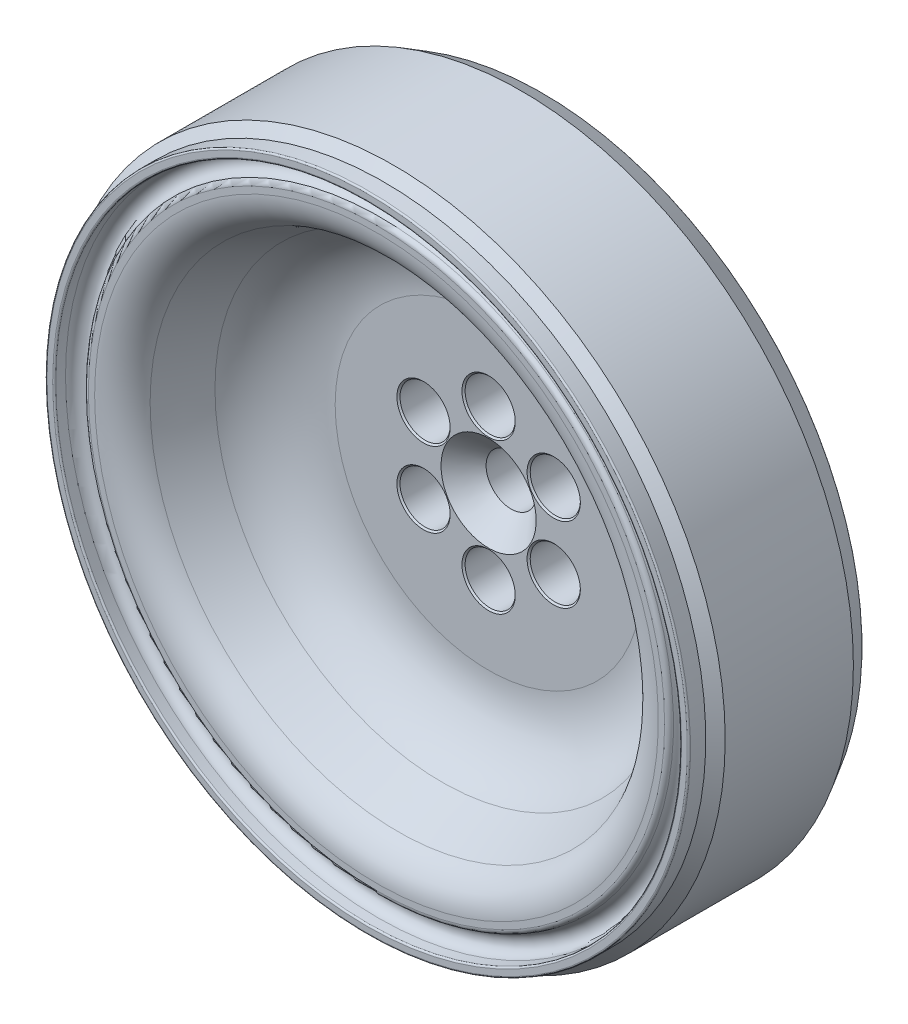
ISO-10303-21;
HEADER;
FILE_DESCRIPTION(('STEP AP214'),'2;1');
FILE_NAME('part.step','',(''),(''),'','','');
FILE_SCHEMA(('AUTOMOTIVE_DESIGN { 1 0 10303 214 1 1 1 1 }'));
ENDSEC;
DATA;
#1=APPLICATION_CONTEXT('core data for automotive mechanical design processes');
#2=APPLICATION_PROTOCOL_DEFINITION('international standard','automotive_design',2000,#1);
#3=PRODUCT_CONTEXT('',#1,'mechanical');
#4=PRODUCT('Part','Part','',(#3));
#5=PRODUCT_RELATED_PRODUCT_CATEGORY('part','',(#4));
#6=PRODUCT_DEFINITION_FORMATION('','',#4);
#7=PRODUCT_DEFINITION_CONTEXT('part definition',#1,'design');
#8=PRODUCT_DEFINITION('design','',#6,#7);
#9=PRODUCT_DEFINITION_SHAPE('','',#8);
#10=(LENGTH_UNIT() NAMED_UNIT(*) SI_UNIT(.MILLI.,.METRE.));
#11=(NAMED_UNIT(*) PLANE_ANGLE_UNIT() SI_UNIT($,.RADIAN.));
#12=(NAMED_UNIT(*) SI_UNIT($,.STERADIAN.) SOLID_ANGLE_UNIT());
#13=UNCERTAINTY_MEASURE_WITH_UNIT(LENGTH_MEASURE(1.E-05),#10,'distance_accuracy_value','');
#14=(GEOMETRIC_REPRESENTATION_CONTEXT(3) GLOBAL_UNCERTAINTY_ASSIGNED_CONTEXT((#13)) GLOBAL_UNIT_ASSIGNED_CONTEXT((#10,
#11,#12)) REPRESENTATION_CONTEXT('',''));
#15=CARTESIAN_POINT('',(0.,0.,0.));
#16=DIRECTION('',(0.,0.,1.));
#17=DIRECTION('',(1.,0.,0.));
#18=AXIS2_PLACEMENT_3D('',#15,#16,#17);
#19=CARTESIAN_POINT('',(0.,0.,34.25));
#20=DIRECTION('',(0.,0.,-1.));
#21=DIRECTION('',(-1.,0.,0.));
#22=AXIS2_PLACEMENT_3D('',#19,#20,#21);
#23=TOROIDAL_SURFACE('',#22,46.0026610811389,0.799999999999995);
#24=CARTESIAN_POINT('',(0.,0.,35.05));
#25=DIRECTION('',(0.,0.,-1.));
#26=DIRECTION('',(-1.,0.,0.));
#27=AXIS2_PLACEMENT_3D('',#24,#25,#26);
#28=CIRCLE('',#27,46.0026610811389);
#29=CARTESIAN_POINT('',(-46.0026610811389,0.,35.05));
#30=VERTEX_POINT('',#29);
#31=EDGE_CURVE('E159',#30,#30,#28,.T.);
#32=ORIENTED_EDGE('',*,*,#31,.T.);
#33=EDGE_LOOP('',(#32));
#34=FACE_BOUND('',#33,.T.);
#35=CARTESIAN_POINT('',(0.,0.,34.4166666666667));
#36=DIRECTION('',(0.,0.,-1.));
#37=DIRECTION('',(-1.,0.,0.));
#38=AXIS2_PLACEMENT_3D('',#35,#36,#37);
#39=CIRCLE('',#38,46.7851073874259);
#40=CARTESIAN_POINT('',(-46.7851073874259,0.,34.4166666666667));
#41=VERTEX_POINT('',#40);
#42=EDGE_CURVE('E234',#41,#41,#39,.T.);
#43=ORIENTED_EDGE('',*,*,#42,.F.);
#44=EDGE_LOOP('',(#43));
#45=FACE_BOUND('',#44,.T.);
#46=ADVANCED_FACE('F47',(#34,#45),#23,.T.);
#47=CARTESIAN_POINT('',(0.,0.,34.75));
#48=DIRECTION('',(0.,0.,-1.));
#49=DIRECTION('',(-1.,0.,0.));
#50=AXIS2_PLACEMENT_3D('',#47,#48,#49);
#51=TOROIDAL_SURFACE('',#50,48.35,1.60000000000001);
#52=ORIENTED_EDGE('',*,*,#42,.T.);
#53=EDGE_LOOP('',(#52));
#54=FACE_BOUND('',#53,.T.);
#55=CARTESIAN_POINT('',(0.,0.,34.75));
#56=DIRECTION('',(0.,0.,-1.));
#57=DIRECTION('',(-1.,0.,0.));
#58=AXIS2_PLACEMENT_3D('',#55,#56,#57);
#59=CIRCLE('',#58,49.95);
#60=CARTESIAN_POINT('',(-49.95,0.,34.75));
#61=VERTEX_POINT('',#60);
#62=EDGE_CURVE('E231',#61,#61,#59,.T.);
#63=ORIENTED_EDGE('',*,*,#62,.F.);
#64=EDGE_LOOP('',(#63));
#65=FACE_BOUND('',#64,.T.);
#66=ADVANCED_FACE('F249',(#54,#65),#51,.F.);
#67=CARTESIAN_POINT('',(0.,0.,0.));
#68=DIRECTION('',(0.,0.,-1.));
#69=DIRECTION('',(-1.,0.,0.));
#70=AXIS2_PLACEMENT_3D('',#67,#68,#69);
#71=CYLINDRICAL_SURFACE('',#70,49.95);
#72=ORIENTED_EDGE('',*,*,#62,.T.);
#73=EDGE_LOOP('',(#72));
#74=FACE_BOUND('',#73,.T.);
#75=CARTESIAN_POINT('',(0.,0.,36.3));
#76=DIRECTION('',(0.,0.,-1.));
#77=DIRECTION('',(-1.,0.,0.));
#78=AXIS2_PLACEMENT_3D('',#75,#76,#77);
#79=CIRCLE('',#78,49.95);
#80=CARTESIAN_POINT('',(-49.95,0.,36.3));
#81=VERTEX_POINT('',#80);
#82=EDGE_CURVE('E228',#81,#81,#79,.T.);
#83=ORIENTED_EDGE('',*,*,#82,.F.);
#84=EDGE_LOOP('',(#83));
#85=FACE_BOUND('',#84,.T.);
#86=ADVANCED_FACE('F254',(#74,#85),#71,.F.);
#87=CARTESIAN_POINT('',(0.,0.,36.3));
#88=DIRECTION('',(0.,0.,-1.));
#89=DIRECTION('',(-1.,0.,0.));
#90=AXIS2_PLACEMENT_3D('',#87,#88,#89);
#91=TOROIDAL_SURFACE('',#90,50.2,0.25);
#92=ORIENTED_EDGE('',*,*,#82,.T.);
#93=EDGE_LOOP('',(#92));
#94=FACE_BOUND('',#93,.T.);
#95=CARTESIAN_POINT('',(0.,0.,36.55));
#96=DIRECTION('',(0.,0.,-1.));
#97=DIRECTION('',(-1.,0.,0.));
#98=AXIS2_PLACEMENT_3D('',#95,#96,#97);
#99=CIRCLE('',#98,50.2);
#100=CARTESIAN_POINT('',(-50.2,0.,36.55));
#101=VERTEX_POINT('',#100);
#102=EDGE_CURVE('E225',#101,#101,#99,.T.);
#103=ORIENTED_EDGE('',*,*,#102,.F.);
#104=EDGE_LOOP('',(#103));
#105=FACE_BOUND('',#104,.T.);
#106=ADVANCED_FACE('F261',(#94,#105),#91,.T.);
#107=CARTESIAN_POINT('',(0.,51.125,36.55));
#108=DIRECTION('',(0.,0.,1.));
#109=DIRECTION('',(1.,0.,0.));
#110=AXIS2_PLACEMENT_3D('',#107,#108,#109);
#111=PLANE('',#110);
#112=ORIENTED_EDGE('',*,*,#102,.T.);
#113=EDGE_LOOP('',(#112));
#114=FACE_BOUND('',#113,.T.);
#115=CARTESIAN_POINT('',(0.,0.,36.55));
#116=DIRECTION('',(0.,0.,-1.));
#117=DIRECTION('',(-1.,0.,0.));
#118=AXIS2_PLACEMENT_3D('',#115,#116,#117);
#119=CIRCLE('',#118,51.125);
#120=CARTESIAN_POINT('',(-51.125,0.,36.55));
#121=VERTEX_POINT('',#120);
#122=EDGE_CURVE('E222',#121,#121,#119,.T.);
#123=ORIENTED_EDGE('',*,*,#122,.F.);
#124=EDGE_LOOP('',(#123));
#125=FACE_BOUND('',#124,.T.);
#126=ADVANCED_FACE('F265',(#114,#125),#111,.T.);
#127=CARTESIAN_POINT('',(0.,0.,36.3));
#128=DIRECTION('',(0.,0.,-1.));
#129=DIRECTION('',(-1.,0.,0.));
#130=AXIS2_PLACEMENT_3D('',#127,#128,#129);
#131=TOROIDAL_SURFACE('',#130,51.125,0.25);
#132=ORIENTED_EDGE('',*,*,#122,.T.);
#133=EDGE_LOOP('',(#132));
#134=FACE_BOUND('',#133,.T.);
#135=CARTESIAN_POINT('',(0.,0.,36.3));
#136=DIRECTION('',(0.,0.,-1.));
#137=DIRECTION('',(-1.,0.,0.));
#138=AXIS2_PLACEMENT_3D('',#135,#136,#137);
#139=CIRCLE('',#138,51.375);
#140=CARTESIAN_POINT('',(-51.375,0.,36.3));
#141=VERTEX_POINT('',#140);
#142=EDGE_CURVE('E219',#141,#141,#139,.T.);
#143=ORIENTED_EDGE('',*,*,#142,.F.);
#144=EDGE_LOOP('',(#143));
#145=FACE_BOUND('',#144,.T.);
#146=ADVANCED_FACE('F269',(#134,#145),#131,.T.);
#147=CARTESIAN_POINT('',(0.,0.,0.));
#148=DIRECTION('',(0.,0.,-1.));
#149=DIRECTION('',(-1.,0.,0.));
#150=AXIS2_PLACEMENT_3D('',#147,#148,#149);
#151=CYLINDRICAL_SURFACE('',#150,51.375);
#152=ORIENTED_EDGE('',*,*,#142,.T.);
#153=EDGE_LOOP('',(#152));
#154=FACE_BOUND('',#153,.T.);
#155=CARTESIAN_POINT('',(0.,0.,33.85));
#156=DIRECTION('',(0.,0.,-1.));
#157=DIRECTION('',(-1.,0.,0.));
#158=AXIS2_PLACEMENT_3D('',#155,#156,#157);
#159=CIRCLE('',#158,51.375);
#160=CARTESIAN_POINT('',(-51.375,0.,33.85));
#161=VERTEX_POINT('',#160);
#162=EDGE_CURVE('E216',#161,#161,#159,.T.);
#163=ORIENTED_EDGE('',*,*,#162,.F.);
#164=EDGE_LOOP('',(#163));
#165=FACE_BOUND('',#164,.T.);
#166=ADVANCED_FACE('F273',(#154,#165),#151,.T.);
#167=CARTESIAN_POINT('',(0.,0.,32.3));
#168=DIRECTION('',(0.,0.,-1.));
#169=DIRECTION('',(-1.,0.,0.));
#170=AXIS2_PLACEMENT_3D('',#167,#168,#169);
#171=CONICAL_SURFACE('',#170,52.925,0.785398163397453);
#172=ORIENTED_EDGE('',*,*,#162,.T.);
#173=EDGE_LOOP('',(#172));
#174=FACE_BOUND('',#173,.T.);
#175=CARTESIAN_POINT('',(0.,0.,32.3));
#176=DIRECTION('',(0.,0.,-1.));
#177=DIRECTION('',(-1.,0.,0.));
#178=AXIS2_PLACEMENT_3D('',#175,#176,#177);
#179=CIRCLE('',#178,52.925);
#180=CARTESIAN_POINT('',(-52.925,0.,32.3));
#181=VERTEX_POINT('',#180);
#182=EDGE_CURVE('E213',#181,#181,#179,.T.);
#183=ORIENTED_EDGE('',*,*,#182,.F.);
#184=EDGE_LOOP('',(#183));
#185=FACE_BOUND('',#184,.T.);
#186=ADVANCED_FACE('F277',(#174,#185),#171,.T.);
#187=CARTESIAN_POINT('',(0.,0.,0.));
#188=DIRECTION('',(0.,0.,-1.));
#189=DIRECTION('',(-1.,0.,0.));
#190=AXIS2_PLACEMENT_3D('',#187,#188,#189);
#191=CYLINDRICAL_SURFACE('',#190,52.925);
#192=ORIENTED_EDGE('',*,*,#182,.T.);
#193=EDGE_LOOP('',(#192));
#194=FACE_BOUND('',#193,.T.);
#195=CARTESIAN_POINT('',(0.,0.,11.8341978045701));
#196=DIRECTION('',(0.,0.,-1.));
#197=DIRECTION('',(-1.,0.,0.));
#198=AXIS2_PLACEMENT_3D('',#195,#196,#197);
#199=CIRCLE('',#198,52.925);
#200=CARTESIAN_POINT('',(-52.925,0.,11.8341978045701));
#201=VERTEX_POINT('',#200);
#202=EDGE_CURVE('E210',#201,#201,#199,.T.);
#203=ORIENTED_EDGE('',*,*,#202,.F.);
#204=EDGE_LOOP('',(#203));
#205=FACE_BOUND('',#204,.T.);
#206=ADVANCED_FACE('F281',(#194,#205),#191,.T.);
#207=CARTESIAN_POINT('',(0.,0.,8.5));
#208=DIRECTION('',(0.,0.,1.));
#209=DIRECTION('',(1.,0.,0.));
#210=AXIS2_PLACEMENT_3D('',#207,#208,#209);
#211=CONICAL_SURFACE('',#210,51.,0.5235987755983);
#212=CARTESIAN_POINT('',(0.,0.,8.62499999999999));
#213=DIRECTION('',(0.,0.,-1.));
#214=DIRECTION('',(-1.,0.,0.));
#215=AXIS2_PLACEMENT_3D('',#212,#213,#214);
#216=CIRCLE('',#215,51.0721687836487);
#217=CARTESIAN_POINT('',(-51.0721687836487,0.,8.62499999999999));
#218=VERTEX_POINT('',#217);
#219=EDGE_CURVE('E11',#218,#218,#216,.F.);
#220=ORIENTED_EDGE('',*,*,#219,.T.);
#221=EDGE_LOOP('',(#220));
#222=FACE_BOUND('',#221,.T.);
#223=ORIENTED_EDGE('',*,*,#202,.T.);
#224=EDGE_LOOP('',(#223));
#225=FACE_BOUND('',#224,.T.);
#226=ADVANCED_FACE('F285',(#222,#225),#211,.T.);
#227=CARTESIAN_POINT('',(0.,37.,8.5));
#228=DIRECTION('',(0.,0.,-1.));
#229=DIRECTION('',(-1.,0.,0.));
#230=AXIS2_PLACEMENT_3D('',#227,#228,#229);
#231=PLANE('',#230);
#232=CARTESIAN_POINT('',(0.,0.,8.5));
#233=DIRECTION('',(0.,0.,-1.));
#234=DIRECTION('',(-1.,0.,0.));
#235=AXIS2_PLACEMENT_3D('',#232,#233,#234);
#236=CIRCLE('',#235,50.8556624327026);
#237=CARTESIAN_POINT('',(-50.8556624327026,0.,8.5));
#238=VERTEX_POINT('',#237);
#239=EDGE_CURVE('E55',#238,#238,#236,.T.);
#240=ORIENTED_EDGE('',*,*,#239,.T.);
#241=EDGE_LOOP('',(#240));
#242=FACE_BOUND('',#241,.T.);
#243=CARTESIAN_POINT('',(-3.14233320495882E-13,-45.,8.5));
#244=DIRECTION('',(0.,0.,-1.));
#245=DIRECTION('',(-1.,0.,0.));
#246=AXIS2_PLACEMENT_3D('',#243,#244,#245);
#247=CIRCLE('',#246,4.5);
#248=CARTESIAN_POINT('',(-4.50000000000031,-45.,8.5));
#249=VERTEX_POINT('',#248);
#250=EDGE_CURVE('E73',#249,#249,#247,.T.);
#251=ORIENTED_EDGE('',*,*,#250,.F.);
#252=EDGE_LOOP('',(#251));
#253=FACE_BOUND('',#252,.T.);
#254=CARTESIAN_POINT('',(0.,45.,8.5));
#255=DIRECTION('',(0.,0.,-1.));
#256=DIRECTION('',(-1.,0.,0.));
#257=AXIS2_PLACEMENT_3D('',#254,#255,#256);
#258=CIRCLE('',#257,4.5);
#259=CARTESIAN_POINT('',(-4.5,45.,8.5));
#260=VERTEX_POINT('',#259);
#261=EDGE_CURVE('E84',#260,#260,#258,.T.);
#262=ORIENTED_EDGE('',*,*,#261,.F.);
#263=EDGE_LOOP('',(#262));
#264=FACE_BOUND('',#263,.T.);
#265=CARTESIAN_POINT('',(0.,0.,8.5));
#266=DIRECTION('',(0.,0.,-1.));
#267=DIRECTION('',(-1.,0.,0.));
#268=AXIS2_PLACEMENT_3D('',#265,#266,#267);
#269=CIRCLE('',#268,37.);
#270=CARTESIAN_POINT('',(-37.,0.,8.5));
#271=VERTEX_POINT('',#270);
#272=EDGE_CURVE('E207',#271,#271,#269,.T.);
#273=ORIENTED_EDGE('',*,*,#272,.F.);
#274=EDGE_LOOP('',(#273));
#275=FACE_BOUND('',#274,.T.);
#276=ADVANCED_FACE('F239',(#242,#253,#264,#275),#231,.T.);
#277=CARTESIAN_POINT('',(0.,0.,0.));
#278=DIRECTION('',(0.,0.,-1.));
#279=DIRECTION('',(-1.,0.,0.));
#280=AXIS2_PLACEMENT_3D('',#277,#278,#279);
#281=CYLINDRICAL_SURFACE('',#280,37.);
#282=ORIENTED_EDGE('',*,*,#272,.T.);
#283=EDGE_LOOP('',(#282));
#284=FACE_BOUND('',#283,.T.);
#285=CARTESIAN_POINT('',(0.,0.,8.8));
#286=DIRECTION('',(0.,0.,-1.));
#287=DIRECTION('',(-1.,0.,0.));
#288=AXIS2_PLACEMENT_3D('',#285,#286,#287);
#289=CIRCLE('',#288,37.);
#290=CARTESIAN_POINT('',(-37.,0.,8.8));
#291=VERTEX_POINT('',#290);
#292=EDGE_CURVE('E204',#291,#291,#289,.T.);
#293=ORIENTED_EDGE('',*,*,#292,.F.);
#294=EDGE_LOOP('',(#293));
#295=FACE_BOUND('',#294,.T.);
#296=ADVANCED_FACE('F291',(#284,#295),#281,.F.);
#297=CARTESIAN_POINT('',(0.,37.,8.8));
#298=DIRECTION('',(0.,0.,-1.));
#299=DIRECTION('',(-1.,0.,0.));
#300=AXIS2_PLACEMENT_3D('',#297,#298,#299);
#301=PLANE('',#300);
#302=ORIENTED_EDGE('',*,*,#292,.T.);
#303=EDGE_LOOP('',(#302));
#304=FACE_BOUND('',#303,.T.);
#305=CARTESIAN_POINT('',(0.,0.,8.8));
#306=DIRECTION('',(0.,0.,-1.));
#307=DIRECTION('',(-1.,0.,0.));
#308=AXIS2_PLACEMENT_3D('',#305,#306,#307);
#309=CIRCLE('',#308,28.);
#310=CARTESIAN_POINT('',(-28.,0.,8.8));
#311=VERTEX_POINT('',#310);
#312=EDGE_CURVE('E201',#311,#311,#309,.T.);
#313=ORIENTED_EDGE('',*,*,#312,.F.);
#314=EDGE_LOOP('',(#313));
#315=FACE_BOUND('',#314,.T.);
#316=ADVANCED_FACE('F294',(#304,#315),#301,.T.);
#317=CARTESIAN_POINT('',(0.,0.,0.));
#318=DIRECTION('',(0.,0.,-1.));
#319=DIRECTION('',(-1.,0.,0.));
#320=AXIS2_PLACEMENT_3D('',#317,#318,#319);
#321=CYLINDRICAL_SURFACE('',#320,28.);
#322=ORIENTED_EDGE('',*,*,#312,.T.);
#323=EDGE_LOOP('',(#322));
#324=FACE_BOUND('',#323,.T.);
#325=CARTESIAN_POINT('',(0.,0.,8.5));
#326=DIRECTION('',(0.,0.,-1.));
#327=DIRECTION('',(-1.,0.,0.));
#328=AXIS2_PLACEMENT_3D('',#325,#326,#327);
#329=CIRCLE('',#328,28.);
#330=CARTESIAN_POINT('',(-28.,0.,8.5));
#331=VERTEX_POINT('',#330);
#332=EDGE_CURVE('E198',#331,#331,#329,.T.);
#333=ORIENTED_EDGE('',*,*,#332,.F.);
#334=EDGE_LOOP('',(#333));
#335=FACE_BOUND('',#334,.T.);
#336=ADVANCED_FACE('F298',(#324,#335),#321,.T.);
#337=CARTESIAN_POINT('',(0.,20.78,8.5));
#338=DIRECTION('',(0.,0.,-1.));
#339=DIRECTION('',(-1.,0.,0.));
#340=AXIS2_PLACEMENT_3D('',#337,#338,#339);
#341=PLANE('',#340);
#342=ORIENTED_EDGE('',*,*,#332,.T.);
#343=EDGE_LOOP('',(#342));
#344=FACE_BOUND('',#343,.T.);
#345=CARTESIAN_POINT('',(0.,0.,8.5));
#346=DIRECTION('',(0.,0.,-1.));
#347=DIRECTION('',(-1.,0.,0.));
#348=AXIS2_PLACEMENT_3D('',#345,#346,#347);
#349=CIRCLE('',#348,20.78);
#350=CARTESIAN_POINT('',(-20.78,0.,8.5));
#351=VERTEX_POINT('',#350);
#352=EDGE_CURVE('E195',#351,#351,#349,.T.);
#353=ORIENTED_EDGE('',*,*,#352,.F.);
#354=EDGE_LOOP('',(#353));
#355=FACE_BOUND('',#354,.T.);
#356=ADVANCED_FACE('F302',(#344,#355),#341,.T.);
#357=CARTESIAN_POINT('',(0.,0.,7.7));
#358=DIRECTION('',(0.,0.,-1.));
#359=DIRECTION('',(-1.,0.,0.));
#360=AXIS2_PLACEMENT_3D('',#357,#358,#359);
#361=TOROIDAL_SURFACE('',#360,20.78,0.799999999999999);
#362=ORIENTED_EDGE('',*,*,#352,.T.);
#363=EDGE_LOOP('',(#362));
#364=FACE_BOUND('',#363,.T.);
#365=CARTESIAN_POINT('',(0.,0.,7.69999999999999));
#366=DIRECTION('',(0.,0.,-1.));
#367=DIRECTION('',(-1.,0.,0.));
#368=AXIS2_PLACEMENT_3D('',#365,#366,#367);
#369=CIRCLE('',#368,19.98);
#370=CARTESIAN_POINT('',(-19.98,0.,7.69999999999999));
#371=VERTEX_POINT('',#370);
#372=EDGE_CURVE('E192',#371,#371,#369,.T.);
#373=ORIENTED_EDGE('',*,*,#372,.F.);
#374=EDGE_LOOP('',(#373));
#375=FACE_BOUND('',#374,.T.);
#376=ADVANCED_FACE('F306',(#364,#375),#361,.F.);
#377=CARTESIAN_POINT('',(0.,0.,0.));
#378=DIRECTION('',(0.,0.,-1.));
#379=DIRECTION('',(-1.,0.,0.));
#380=AXIS2_PLACEMENT_3D('',#377,#378,#379);
#381=CYLINDRICAL_SURFACE('',#380,19.98);
#382=ORIENTED_EDGE('',*,*,#372,.T.);
#383=EDGE_LOOP('',(#382));
#384=FACE_BOUND('',#383,.T.);
#385=CARTESIAN_POINT('',(0.,0.,1.));
#386=DIRECTION('',(0.,0.,-1.));
#387=DIRECTION('',(-1.,0.,0.));
#388=AXIS2_PLACEMENT_3D('',#385,#386,#387);
#389=CIRCLE('',#388,19.98);
#390=CARTESIAN_POINT('',(-19.98,0.,1.));
#391=VERTEX_POINT('',#390);
#392=EDGE_CURVE('E189',#391,#391,#389,.T.);
#393=ORIENTED_EDGE('',*,*,#392,.F.);
#394=EDGE_LOOP('',(#393));
#395=FACE_BOUND('',#394,.T.);
#396=ADVANCED_FACE('F310',(#384,#395),#381,.T.);
#397=CARTESIAN_POINT('',(0.,0.,0.));
#398=DIRECTION('',(0.,0.,1.));
#399=DIRECTION('',(1.,0.,0.));
#400=AXIS2_PLACEMENT_3D('',#397,#398,#399);
#401=CONICAL_SURFACE('',#400,18.98,0.785398163397449);
#402=ORIENTED_EDGE('',*,*,#392,.T.);
#403=EDGE_LOOP('',(#402));
#404=FACE_BOUND('',#403,.T.);
#405=CARTESIAN_POINT('',(0.,0.,0.));
#406=DIRECTION('',(0.,0.,-1.));
#407=DIRECTION('',(-1.,0.,0.));
#408=AXIS2_PLACEMENT_3D('',#405,#406,#407);
#409=CIRCLE('',#408,18.98);
#410=CARTESIAN_POINT('',(-18.98,0.,0.));
#411=VERTEX_POINT('',#410);
#412=EDGE_CURVE('E186',#411,#411,#409,.T.);
#413=ORIENTED_EDGE('',*,*,#412,.F.);
#414=EDGE_LOOP('',(#413));
#415=FACE_BOUND('',#414,.T.);
#416=ADVANCED_FACE('F314',(#404,#415),#401,.T.);
#417=CARTESIAN_POINT('',(0.,4.75,0.));
#418=DIRECTION('',(0.,0.,-1.));
#419=DIRECTION('',(-1.,0.,0.));
#420=AXIS2_PLACEMENT_3D('',#417,#418,#419);
#421=PLANE('',#420);
#422=CARTESIAN_POINT('',(-10.3923048454132,6.00000000000012,0.));
#423=DIRECTION('',(0.,0.,-1.));
#424=DIRECTION('',(-1.,0.,0.));
#425=AXIS2_PLACEMENT_3D('',#422,#423,#424);
#426=CIRCLE('',#425,4.5);
#427=CARTESIAN_POINT('',(-14.8923048454132,6.00000000000012,0.));
#428=VERTEX_POINT('',#427);
#429=EDGE_CURVE('E96',#428,#428,#426,.T.);
#430=ORIENTED_EDGE('',*,*,#429,.F.);
#431=EDGE_LOOP('',(#430));
#432=FACE_BOUND('',#431,.T.);
#433=CARTESIAN_POINT('',(-10.3923048454133,-5.9999999999999,0.));
#434=DIRECTION('',(0.,0.,-1.));
#435=DIRECTION('',(-1.,0.,0.));
#436=AXIS2_PLACEMENT_3D('',#433,#434,#435);
#437=CIRCLE('',#436,4.5);
#438=CARTESIAN_POINT('',(-14.8923048454133,-5.9999999999999,0.));
#439=VERTEX_POINT('',#438);
#440=EDGE_CURVE('E108',#439,#439,#437,.T.);
#441=ORIENTED_EDGE('',*,*,#440,.F.);
#442=EDGE_LOOP('',(#441));
#443=FACE_BOUND('',#442,.T.);
#444=CARTESIAN_POINT('',(0.,-12.,0.));
#445=DIRECTION('',(0.,0.,-1.));
#446=DIRECTION('',(-1.,0.,0.));
#447=AXIS2_PLACEMENT_3D('',#444,#445,#446);
#448=CIRCLE('',#447,4.5);
#449=CARTESIAN_POINT('',(-4.50000000000008,-12.,0.));
#450=VERTEX_POINT('',#449);
#451=EDGE_CURVE('E120',#450,#450,#448,.T.);
#452=ORIENTED_EDGE('',*,*,#451,.F.);
#453=EDGE_LOOP('',(#452));
#454=FACE_BOUND('',#453,.T.);
#455=CARTESIAN_POINT('',(10.3923048454132,-6.00000000000005,0.));
#456=DIRECTION('',(0.,0.,-1.));
#457=DIRECTION('',(-1.,0.,0.));
#458=AXIS2_PLACEMENT_3D('',#455,#456,#457);
#459=CIRCLE('',#458,4.5);
#460=CARTESIAN_POINT('',(5.89230484541324,-6.00000000000005,0.));
#461=VERTEX_POINT('',#460);
#462=EDGE_CURVE('E132',#461,#461,#459,.T.);
#463=ORIENTED_EDGE('',*,*,#462,.F.);
#464=EDGE_LOOP('',(#463));
#465=FACE_BOUND('',#464,.T.);
#466=CARTESIAN_POINT('',(10.3923048454133,5.99999999999998,0.));
#467=DIRECTION('',(0.,0.,-1.));
#468=DIRECTION('',(-1.,0.,0.));
#469=AXIS2_PLACEMENT_3D('',#466,#467,#468);
#470=CIRCLE('',#469,4.5);
#471=CARTESIAN_POINT('',(5.89230484541328,5.99999999999998,0.));
#472=VERTEX_POINT('',#471);
#473=EDGE_CURVE('E144',#472,#472,#470,.T.);
#474=ORIENTED_EDGE('',*,*,#473,.F.);
#475=EDGE_LOOP('',(#474));
#476=FACE_BOUND('',#475,.T.);
#477=CARTESIAN_POINT('',(0.,12.,0.));
#478=DIRECTION('',(0.,0.,-1.));
#479=DIRECTION('',(-1.,0.,0.));
#480=AXIS2_PLACEMENT_3D('',#477,#478,#479);
#481=CIRCLE('',#480,4.5);
#482=CARTESIAN_POINT('',(-4.5,12.,0.));
#483=VERTEX_POINT('',#482);
#484=EDGE_CURVE('E156',#483,#483,#481,.T.);
#485=ORIENTED_EDGE('',*,*,#484,.F.);
#486=EDGE_LOOP('',(#485));
#487=FACE_BOUND('',#486,.T.);
#488=ORIENTED_EDGE('',*,*,#412,.T.);
#489=EDGE_LOOP('',(#488));
#490=FACE_BOUND('',#489,.T.);
#491=CARTESIAN_POINT('',(0.,0.,0.));
#492=DIRECTION('',(0.,0.,-1.));
#493=DIRECTION('',(-1.,0.,0.));
#494=AXIS2_PLACEMENT_3D('',#491,#492,#493);
#495=CIRCLE('',#494,4.75);
#496=CARTESIAN_POINT('',(-4.75,0.,0.));
#497=VERTEX_POINT('',#496);
#498=EDGE_CURVE('E183',#497,#497,#495,.T.);
#499=ORIENTED_EDGE('',*,*,#498,.F.);
#500=EDGE_LOOP('',(#499));
#501=FACE_BOUND('',#500,.T.);
#502=ADVANCED_FACE('F318',(#432,#443,#454,#465,#476,#487,#490,#501),#421,.T.);
#503=CARTESIAN_POINT('',(0.,0.,0.749999999999998));
#504=DIRECTION('',(0.,0.,-1.));
#505=DIRECTION('',(-1.,0.,0.));
#506=AXIS2_PLACEMENT_3D('',#503,#504,#505);
#507=CONICAL_SURFACE('',#506,4.,0.78539816339745);
#508=ORIENTED_EDGE('',*,*,#498,.T.);
#509=EDGE_LOOP('',(#508));
#510=FACE_BOUND('',#509,.T.);
#511=CARTESIAN_POINT('',(0.,0.,0.749999999999998));
#512=DIRECTION('',(0.,0.,-1.));
#513=DIRECTION('',(-1.,0.,0.));
#514=AXIS2_PLACEMENT_3D('',#511,#512,#513);
#515=CIRCLE('',#514,4.);
#516=CARTESIAN_POINT('',(-4.,0.,0.749999999999998));
#517=VERTEX_POINT('',#516);
#518=EDGE_CURVE('E180',#517,#517,#515,.T.);
#519=ORIENTED_EDGE('',*,*,#518,.F.);
#520=EDGE_LOOP('',(#519));
#521=FACE_BOUND('',#520,.T.);
#522=ADVANCED_FACE('F322',(#510,#521),#507,.F.);
#523=CARTESIAN_POINT('',(0.,0.,0.));
#524=DIRECTION('',(0.,0.,-1.));
#525=DIRECTION('',(-1.,0.,0.));
#526=AXIS2_PLACEMENT_3D('',#523,#524,#525);
#527=CYLINDRICAL_SURFACE('',#526,4.);
#528=ORIENTED_EDGE('',*,*,#518,.T.);
#529=EDGE_LOOP('',(#528));
#530=FACE_BOUND('',#529,.T.);
#531=CARTESIAN_POINT('',(0.,0.,13.55));
#532=DIRECTION('',(0.,0.,-1.));
#533=DIRECTION('',(-1.,0.,0.));
#534=AXIS2_PLACEMENT_3D('',#531,#532,#533);
#535=CIRCLE('',#534,4.);
#536=CARTESIAN_POINT('',(-4.,0.,13.55));
#537=VERTEX_POINT('',#536);
#538=EDGE_CURVE('E177',#537,#537,#535,.T.);
#539=ORIENTED_EDGE('',*,*,#538,.F.);
#540=EDGE_LOOP('',(#539));
#541=FACE_BOUND('',#540,.T.);
#542=ADVANCED_FACE('F326',(#530,#541),#527,.F.);
#543=CARTESIAN_POINT('',(0.,0.,17.15));
#544=DIRECTION('',(0.,0.,1.));
#545=DIRECTION('',(1.,0.,0.));
#546=AXIS2_PLACEMENT_3D('',#543,#544,#545);
#547=CONICAL_SURFACE('',#546,7.6,0.78539816339745);
#548=ORIENTED_EDGE('',*,*,#538,.T.);
#549=EDGE_LOOP('',(#548));
#550=FACE_BOUND('',#549,.T.);
#551=CARTESIAN_POINT('',(0.,0.,17.15));
#552=DIRECTION('',(0.,0.,-1.));
#553=DIRECTION('',(-1.,0.,0.));
#554=AXIS2_PLACEMENT_3D('',#551,#552,#553);
#555=CIRCLE('',#554,7.6);
#556=CARTESIAN_POINT('',(-7.6,0.,17.15));
#557=VERTEX_POINT('',#556);
#558=EDGE_CURVE('E174',#557,#557,#555,.T.);
#559=ORIENTED_EDGE('',*,*,#558,.F.);
#560=EDGE_LOOP('',(#559));
#561=FACE_BOUND('',#560,.T.);
#562=ADVANCED_FACE('F330',(#550,#561),#547,.F.);
#563=CARTESIAN_POINT('',(0.,24.5,17.15));
#564=DIRECTION('',(0.,0.,1.));
#565=DIRECTION('',(1.,0.,0.));
#566=AXIS2_PLACEMENT_3D('',#563,#564,#565);
#567=PLANE('',#566);
#568=CARTESIAN_POINT('',(-10.3923048454132,6.00000000000012,17.15));
#569=DIRECTION('',(0.,0.,-1.));
#570=DIRECTION('',(-1.,0.,0.));
#571=AXIS2_PLACEMENT_3D('',#568,#569,#570);
#572=CIRCLE('',#571,4.25);
#573=CARTESIAN_POINT('',(-14.6423048454132,6.00000000000012,17.15));
#574=VERTEX_POINT('',#573);
#575=EDGE_CURVE('E87',#574,#574,#572,.T.);
#576=ORIENTED_EDGE('',*,*,#575,.T.);
#577=EDGE_LOOP('',(#576));
#578=FACE_BOUND('',#577,.T.);
#579=CARTESIAN_POINT('',(-10.3923048454133,-5.9999999999999,17.15));
#580=DIRECTION('',(0.,0.,-1.));
#581=DIRECTION('',(-1.,0.,0.));
#582=AXIS2_PLACEMENT_3D('',#579,#580,#581);
#583=CIRCLE('',#582,4.25);
#584=CARTESIAN_POINT('',(-14.6423048454133,-5.9999999999999,17.15));
#585=VERTEX_POINT('',#584);
#586=EDGE_CURVE('E99',#585,#585,#583,.T.);
#587=ORIENTED_EDGE('',*,*,#586,.T.);
#588=EDGE_LOOP('',(#587));
#589=FACE_BOUND('',#588,.T.);
#590=CARTESIAN_POINT('',(0.,-12.,17.15));
#591=DIRECTION('',(0.,0.,-1.));
#592=DIRECTION('',(-1.,0.,0.));
#593=AXIS2_PLACEMENT_3D('',#590,#591,#592);
#594=CIRCLE('',#593,4.25);
#595=CARTESIAN_POINT('',(-4.25000000000008,-12.,17.15));
#596=VERTEX_POINT('',#595);
#597=EDGE_CURVE('E111',#596,#596,#594,.T.);
#598=ORIENTED_EDGE('',*,*,#597,.T.);
#599=EDGE_LOOP('',(#598));
#600=FACE_BOUND('',#599,.T.);
#601=CARTESIAN_POINT('',(10.3923048454132,-6.00000000000005,17.15));
#602=DIRECTION('',(0.,0.,-1.));
#603=DIRECTION('',(-1.,0.,0.));
#604=AXIS2_PLACEMENT_3D('',#601,#602,#603);
#605=CIRCLE('',#604,4.25);
#606=CARTESIAN_POINT('',(6.14230484541324,-6.00000000000005,17.15));
#607=VERTEX_POINT('',#606);
#608=EDGE_CURVE('E123',#607,#607,#605,.T.);
#609=ORIENTED_EDGE('',*,*,#608,.T.);
#610=EDGE_LOOP('',(#609));
#611=FACE_BOUND('',#610,.T.);
#612=CARTESIAN_POINT('',(10.3923048454133,5.99999999999998,17.15));
#613=DIRECTION('',(0.,0.,-1.));
#614=DIRECTION('',(-1.,0.,0.));
#615=AXIS2_PLACEMENT_3D('',#612,#613,#614);
#616=CIRCLE('',#615,4.24999999999999);
#617=CARTESIAN_POINT('',(6.14230484541328,5.99999999999998,17.15));
#618=VERTEX_POINT('',#617);
#619=EDGE_CURVE('E135',#618,#618,#616,.T.);
#620=ORIENTED_EDGE('',*,*,#619,.T.);
#621=EDGE_LOOP('',(#620));
#622=FACE_BOUND('',#621,.T.);
#623=CARTESIAN_POINT('',(0.,12.,17.15));
#624=DIRECTION('',(0.,0.,-1.));
#625=DIRECTION('',(-1.,0.,0.));
#626=AXIS2_PLACEMENT_3D('',#623,#624,#625);
#627=CIRCLE('',#626,4.25);
#628=CARTESIAN_POINT('',(-4.25,12.,17.15));
#629=VERTEX_POINT('',#628);
#630=EDGE_CURVE('E147',#629,#629,#627,.T.);
#631=ORIENTED_EDGE('',*,*,#630,.T.);
#632=EDGE_LOOP('',(#631));
#633=FACE_BOUND('',#632,.T.);
#634=ORIENTED_EDGE('',*,*,#558,.T.);
#635=EDGE_LOOP('',(#634));
#636=FACE_BOUND('',#635,.T.);
#637=CARTESIAN_POINT('',(0.,0.,17.15));
#638=DIRECTION('',(0.,0.,-1.));
#639=DIRECTION('',(-1.,0.,0.));
#640=AXIS2_PLACEMENT_3D('',#637,#638,#639);
#641=CIRCLE('',#640,24.5);
#642=CARTESIAN_POINT('',(-24.5,0.,17.15));
#643=VERTEX_POINT('',#642);
#644=EDGE_CURVE('E171',#643,#643,#641,.T.);
#645=ORIENTED_EDGE('',*,*,#644,.F.);
#646=EDGE_LOOP('',(#645));
#647=FACE_BOUND('',#646,.T.);
#648=ADVANCED_FACE('F334',(#578,#589,#600,#611,#622,#633,#636,#647),#567,.T.);
#649=CARTESIAN_POINT('',(0.,0.,30.15));
#650=DIRECTION('',(0.,0.,-1.));
#651=DIRECTION('',(-1.,0.,0.));
#652=AXIS2_PLACEMENT_3D('',#649,#650,#651);
#653=TOROIDAL_SURFACE('',#652,24.5,13.);
#654=ORIENTED_EDGE('',*,*,#644,.T.);
#655=EDGE_LOOP('',(#654));
#656=FACE_BOUND('',#655,.T.);
#657=CARTESIAN_POINT('',(0.,0.,24.5886224908819));
#658=DIRECTION('',(0.,0.,-1.));
#659=DIRECTION('',(-1.,0.,0.));
#660=AXIS2_PLACEMENT_3D('',#657,#658,#659);
#661=CIRCLE('',#660,36.2503651092668);
#662=CARTESIAN_POINT('',(-36.2503651092668,0.,24.5886224908819));
#663=VERTEX_POINT('',#662);
#664=EDGE_CURVE('E168',#663,#663,#661,.T.);
#665=ORIENTED_EDGE('',*,*,#664,.F.);
#666=EDGE_LOOP('',(#665));
#667=FACE_BOUND('',#666,.T.);
#668=ADVANCED_FACE('F338',(#656,#667),#653,.F.);
#669=CARTESIAN_POINT('',(0.,0.,31.616789619593));
#670=DIRECTION('',(0.,0.,1.));
#671=DIRECTION('',(1.,0.,0.));
#672=AXIS2_PLACEMENT_3D('',#669,#670,#671);
#673=CONICAL_SURFACE('',#672,39.5767545649538,0.442055487770291);
#674=ORIENTED_EDGE('',*,*,#664,.T.);
#675=EDGE_LOOP('',(#674));
#676=FACE_BOUND('',#675,.T.);
#677=CARTESIAN_POINT('',(0.,0.,31.616789619593));
#678=DIRECTION('',(0.,0.,-1.));
#679=DIRECTION('',(-1.,0.,0.));
#680=AXIS2_PLACEMENT_3D('',#677,#678,#679);
#681=CIRCLE('',#680,39.5767545649538);
#682=CARTESIAN_POINT('',(-39.5767545649538,0.,31.616789619593));
#683=VERTEX_POINT('',#682);
#684=EDGE_CURVE('E165',#683,#683,#681,.T.);
#685=ORIENTED_EDGE('',*,*,#684,.F.);
#686=EDGE_LOOP('',(#685));
#687=FACE_BOUND('',#686,.T.);
#688=ADVANCED_FACE('F342',(#676,#687),#673,.F.);
#689=CARTESIAN_POINT('',(0.,0.,29.05));
#690=DIRECTION('',(0.,0.,-1.));
#691=DIRECTION('',(-1.,0.,0.));
#692=AXIS2_PLACEMENT_3D('',#689,#690,#691);
#693=TOROIDAL_SURFACE('',#692,45.,6.);
#694=ORIENTED_EDGE('',*,*,#684,.T.);
#695=EDGE_LOOP('',(#694));
#696=FACE_BOUND('',#695,.T.);
#697=CARTESIAN_POINT('',(0.,0.,35.05));
#698=DIRECTION('',(0.,0.,-1.));
#699=DIRECTION('',(-1.,0.,0.));
#700=AXIS2_PLACEMENT_3D('',#697,#698,#699);
#701=CIRCLE('',#700,45.);
#702=CARTESIAN_POINT('',(-45.,0.,35.05));
#703=VERTEX_POINT('',#702);
#704=EDGE_CURVE('E162',#703,#703,#701,.T.);
#705=ORIENTED_EDGE('',*,*,#704,.F.);
#706=EDGE_LOOP('',(#705));
#707=FACE_BOUND('',#706,.T.);
#708=ADVANCED_FACE('F346',(#696,#707),#693,.T.);
#709=CARTESIAN_POINT('',(0.,46.0026610811389,35.05));
#710=DIRECTION('',(0.,0.,1.));
#711=DIRECTION('',(1.,0.,0.));
#712=AXIS2_PLACEMENT_3D('',#709,#710,#711);
#713=PLANE('',#712);
#714=ORIENTED_EDGE('',*,*,#704,.T.);
#715=EDGE_LOOP('',(#714));
#716=FACE_BOUND('',#715,.T.);
#717=ORIENTED_EDGE('',*,*,#31,.F.);
#718=EDGE_LOOP('',(#717));
#719=FACE_BOUND('',#718,.T.);
#720=ADVANCED_FACE('F350',(#716,#719),#713,.T.);
#721=CARTESIAN_POINT('',(0.,12.,0.));
#722=DIRECTION('',(0.,0.,-1.));
#723=DIRECTION('',(-1.,0.,0.));
#724=AXIS2_PLACEMENT_3D('',#721,#722,#723);
#725=CONICAL_SURFACE('',#724,4.5,0.785398163397446);
#726=CARTESIAN_POINT('',(0.,12.,0.500000000000002));
#727=DIRECTION('',(0.,0.,-1.));
#728=DIRECTION('',(-1.,0.,0.));
#729=AXIS2_PLACEMENT_3D('',#726,#727,#728);
#730=CIRCLE('',#729,4.);
#731=CARTESIAN_POINT('',(-4.,12.,0.500000000000002));
#732=VERTEX_POINT('',#731);
#733=EDGE_CURVE('E153',#732,#732,#730,.T.);
#734=ORIENTED_EDGE('',*,*,#733,.F.);
#735=EDGE_LOOP('',(#734));
#736=FACE_BOUND('',#735,.T.);
#737=ORIENTED_EDGE('',*,*,#484,.T.);
#738=EDGE_LOOP('',(#737));
#739=FACE_BOUND('',#738,.T.);
#740=ADVANCED_FACE('F354',(#736,#739),#725,.F.);
#741=CARTESIAN_POINT('',(0.,12.,0.));
#742=DIRECTION('',(0.,0.,-1.));
#743=DIRECTION('',(-1.,0.,0.));
#744=AXIS2_PLACEMENT_3D('',#741,#742,#743);
#745=CYLINDRICAL_SURFACE('',#744,4.);
#746=CARTESIAN_POINT('',(0.,12.,16.9));
#747=DIRECTION('',(0.,0.,-1.));
#748=DIRECTION('',(-1.,0.,0.));
#749=AXIS2_PLACEMENT_3D('',#746,#747,#748);
#750=CIRCLE('',#749,4.);
#751=CARTESIAN_POINT('',(-4.,12.,16.9));
#752=VERTEX_POINT('',#751);
#753=EDGE_CURVE('E150',#752,#752,#750,.T.);
#754=ORIENTED_EDGE('',*,*,#753,.F.);
#755=EDGE_LOOP('',(#754));
#756=FACE_BOUND('',#755,.T.);
#757=ORIENTED_EDGE('',*,*,#733,.T.);
#758=EDGE_LOOP('',(#757));
#759=FACE_BOUND('',#758,.T.);
#760=ADVANCED_FACE('F358',(#756,#759),#745,.F.);
#761=CARTESIAN_POINT('',(0.,12.,16.9));
#762=DIRECTION('',(0.,0.,1.));
#763=DIRECTION('',(1.,0.,0.));
#764=AXIS2_PLACEMENT_3D('',#761,#762,#763);
#765=CONICAL_SURFACE('',#764,4.,0.785398163397447);
#766=ORIENTED_EDGE('',*,*,#630,.F.);
#767=EDGE_LOOP('',(#766));
#768=FACE_BOUND('',#767,.T.);
#769=ORIENTED_EDGE('',*,*,#753,.T.);
#770=EDGE_LOOP('',(#769));
#771=FACE_BOUND('',#770,.T.);
#772=ADVANCED_FACE('F362',(#768,#771),#765,.F.);
#773=CARTESIAN_POINT('',(10.3923048454133,5.99999999999998,0.));
#774=DIRECTION('',(0.,0.,-1.));
#775=DIRECTION('',(-1.,0.,0.));
#776=AXIS2_PLACEMENT_3D('',#773,#774,#775);
#777=CONICAL_SURFACE('',#776,4.5,0.785398163397447);
#778=CARTESIAN_POINT('',(10.3923048454133,5.99999999999998,0.500000000000002));
#779=DIRECTION('',(0.,0.,-1.));
#780=DIRECTION('',(-1.,0.,0.));
#781=AXIS2_PLACEMENT_3D('',#778,#779,#780);
#782=CIRCLE('',#781,4.);
#783=CARTESIAN_POINT('',(6.39230484541328,5.99999999999998,0.500000000000002));
#784=VERTEX_POINT('',#783);
#785=EDGE_CURVE('E141',#784,#784,#782,.T.);
#786=ORIENTED_EDGE('',*,*,#785,.F.);
#787=EDGE_LOOP('',(#786));
#788=FACE_BOUND('',#787,.T.);
#789=ORIENTED_EDGE('',*,*,#473,.T.);
#790=EDGE_LOOP('',(#789));
#791=FACE_BOUND('',#790,.T.);
#792=ADVANCED_FACE('F366',(#788,#791),#777,.F.);
#793=CARTESIAN_POINT('',(10.3923048454133,5.99999999999998,0.));
#794=DIRECTION('',(0.,0.,-1.));
#795=DIRECTION('',(-1.,0.,0.));
#796=AXIS2_PLACEMENT_3D('',#793,#794,#795);
#797=CYLINDRICAL_SURFACE('',#796,4.);
#798=CARTESIAN_POINT('',(10.3923048454133,5.99999999999998,16.9));
#799=DIRECTION('',(0.,0.,-1.));
#800=DIRECTION('',(-1.,0.,0.));
#801=AXIS2_PLACEMENT_3D('',#798,#799,#800);
#802=CIRCLE('',#801,4.);
#803=CARTESIAN_POINT('',(6.39230484541328,5.99999999999998,16.9));
#804=VERTEX_POINT('',#803);
#805=EDGE_CURVE('E138',#804,#804,#802,.T.);
#806=ORIENTED_EDGE('',*,*,#805,.F.);
#807=EDGE_LOOP('',(#806));
#808=FACE_BOUND('',#807,.T.);
#809=ORIENTED_EDGE('',*,*,#785,.T.);
#810=EDGE_LOOP('',(#809));
#811=FACE_BOUND('',#810,.T.);
#812=ADVANCED_FACE('F370',(#808,#811),#797,.F.);
#813=CARTESIAN_POINT('',(10.3923048454133,5.99999999999998,16.9));
#814=DIRECTION('',(0.,0.,1.));
#815=DIRECTION('',(1.,0.,0.));
#816=AXIS2_PLACEMENT_3D('',#813,#814,#815);
#817=CONICAL_SURFACE('',#816,4.,0.785398163397445);
#818=ORIENTED_EDGE('',*,*,#619,.F.);
#819=EDGE_LOOP('',(#818));
#820=FACE_BOUND('',#819,.T.);
#821=ORIENTED_EDGE('',*,*,#805,.T.);
#822=EDGE_LOOP('',(#821));
#823=FACE_BOUND('',#822,.T.);
#824=ADVANCED_FACE('F374',(#820,#823),#817,.F.);
#825=CARTESIAN_POINT('',(10.3923048454132,-6.00000000000005,0.));
#826=DIRECTION('',(0.,0.,-1.));
#827=DIRECTION('',(-1.,0.,0.));
#828=AXIS2_PLACEMENT_3D('',#825,#826,#827);
#829=CONICAL_SURFACE('',#828,4.5,0.785398163397445);
#830=CARTESIAN_POINT('',(10.3923048454132,-6.00000000000005,0.500000000000002));
#831=DIRECTION('',(0.,0.,-1.));
#832=DIRECTION('',(-1.,0.,0.));
#833=AXIS2_PLACEMENT_3D('',#830,#831,#832);
#834=CIRCLE('',#833,4.);
#835=CARTESIAN_POINT('',(6.39230484541324,-6.00000000000005,0.500000000000002));
#836=VERTEX_POINT('',#835);
#837=EDGE_CURVE('E129',#836,#836,#834,.T.);
#838=ORIENTED_EDGE('',*,*,#837,.F.);
#839=EDGE_LOOP('',(#838));
#840=FACE_BOUND('',#839,.T.);
#841=ORIENTED_EDGE('',*,*,#462,.T.);
#842=EDGE_LOOP('',(#841));
#843=FACE_BOUND('',#842,.T.);
#844=ADVANCED_FACE('F378',(#840,#843),#829,.F.);
#845=CARTESIAN_POINT('',(10.3923048454132,-6.00000000000005,0.));
#846=DIRECTION('',(0.,0.,-1.));
#847=DIRECTION('',(-1.,0.,0.));
#848=AXIS2_PLACEMENT_3D('',#845,#846,#847);
#849=CYLINDRICAL_SURFACE('',#848,4.);
#850=CARTESIAN_POINT('',(10.3923048454132,-6.00000000000005,16.9));
#851=DIRECTION('',(0.,0.,-1.));
#852=DIRECTION('',(-1.,0.,0.));
#853=AXIS2_PLACEMENT_3D('',#850,#851,#852);
#854=CIRCLE('',#853,4.);
#855=CARTESIAN_POINT('',(6.39230484541324,-6.00000000000005,16.9));
#856=VERTEX_POINT('',#855);
#857=EDGE_CURVE('E126',#856,#856,#854,.T.);
#858=ORIENTED_EDGE('',*,*,#857,.F.);
#859=EDGE_LOOP('',(#858));
#860=FACE_BOUND('',#859,.T.);
#861=ORIENTED_EDGE('',*,*,#837,.T.);
#862=EDGE_LOOP('',(#861));
#863=FACE_BOUND('',#862,.T.);
#864=ADVANCED_FACE('F382',(#860,#863),#849,.F.);
#865=CARTESIAN_POINT('',(10.3923048454132,-6.00000000000005,16.9));
#866=DIRECTION('',(0.,0.,1.));
#867=DIRECTION('',(1.,0.,0.));
#868=AXIS2_PLACEMENT_3D('',#865,#866,#867);
#869=CONICAL_SURFACE('',#868,4.,0.785398163397448);
#870=ORIENTED_EDGE('',*,*,#608,.F.);
#871=EDGE_LOOP('',(#870));
#872=FACE_BOUND('',#871,.T.);
#873=ORIENTED_EDGE('',*,*,#857,.T.);
#874=EDGE_LOOP('',(#873));
#875=FACE_BOUND('',#874,.T.);
#876=ADVANCED_FACE('F386',(#872,#875),#869,.F.);
#877=CARTESIAN_POINT('',(0.,-12.,0.));
#878=DIRECTION('',(0.,0.,-1.));
#879=DIRECTION('',(-1.,0.,0.));
#880=AXIS2_PLACEMENT_3D('',#877,#878,#879);
#881=CONICAL_SURFACE('',#880,4.5,0.785398163397446);
#882=CARTESIAN_POINT('',(0.,-12.,0.500000000000002));
#883=DIRECTION('',(0.,0.,-1.));
#884=DIRECTION('',(-1.,0.,0.));
#885=AXIS2_PLACEMENT_3D('',#882,#883,#884);
#886=CIRCLE('',#885,4.);
#887=CARTESIAN_POINT('',(-4.00000000000008,-12.,0.500000000000002));
#888=VERTEX_POINT('',#887);
#889=EDGE_CURVE('E117',#888,#888,#886,.T.);
#890=ORIENTED_EDGE('',*,*,#889,.F.);
#891=EDGE_LOOP('',(#890));
#892=FACE_BOUND('',#891,.T.);
#893=ORIENTED_EDGE('',*,*,#451,.T.);
#894=EDGE_LOOP('',(#893));
#895=FACE_BOUND('',#894,.T.);
#896=ADVANCED_FACE('F390',(#892,#895),#881,.F.);
#897=CARTESIAN_POINT('',(0.,-12.,0.));
#898=DIRECTION('',(0.,0.,-1.));
#899=DIRECTION('',(-1.,0.,0.));
#900=AXIS2_PLACEMENT_3D('',#897,#898,#899);
#901=CYLINDRICAL_SURFACE('',#900,4.);
#902=CARTESIAN_POINT('',(0.,-12.,16.9));
#903=DIRECTION('',(0.,0.,-1.));
#904=DIRECTION('',(-1.,0.,0.));
#905=AXIS2_PLACEMENT_3D('',#902,#903,#904);
#906=CIRCLE('',#905,4.);
#907=CARTESIAN_POINT('',(-4.00000000000008,-12.,16.9));
#908=VERTEX_POINT('',#907);
#909=EDGE_CURVE('E114',#908,#908,#906,.T.);
#910=ORIENTED_EDGE('',*,*,#909,.F.);
#911=EDGE_LOOP('',(#910));
#912=FACE_BOUND('',#911,.T.);
#913=ORIENTED_EDGE('',*,*,#889,.T.);
#914=EDGE_LOOP('',(#913));
#915=FACE_BOUND('',#914,.T.);
#916=ADVANCED_FACE('F394',(#912,#915),#901,.F.);
#917=CARTESIAN_POINT('',(0.,-12.,16.9));
#918=DIRECTION('',(0.,0.,1.));
#919=DIRECTION('',(1.,0.,0.));
#920=AXIS2_PLACEMENT_3D('',#917,#918,#919);
#921=CONICAL_SURFACE('',#920,4.,0.785398163397447);
#922=ORIENTED_EDGE('',*,*,#597,.F.);
#923=EDGE_LOOP('',(#922));
#924=FACE_BOUND('',#923,.T.);
#925=ORIENTED_EDGE('',*,*,#909,.T.);
#926=EDGE_LOOP('',(#925));
#927=FACE_BOUND('',#926,.T.);
#928=ADVANCED_FACE('F398',(#924,#927),#921,.F.);
#929=CARTESIAN_POINT('',(-10.3923048454133,-5.9999999999999,0.));
#930=DIRECTION('',(0.,0.,-1.));
#931=DIRECTION('',(-1.,0.,0.));
#932=AXIS2_PLACEMENT_3D('',#929,#930,#931);
#933=CONICAL_SURFACE('',#932,4.5,0.785398163397446);
#934=CARTESIAN_POINT('',(-10.3923048454133,-5.9999999999999,0.500000000000002));
#935=DIRECTION('',(0.,0.,-1.));
#936=DIRECTION('',(-1.,0.,0.));
#937=AXIS2_PLACEMENT_3D('',#934,#935,#936);
#938=CIRCLE('',#937,4.);
#939=CARTESIAN_POINT('',(-14.3923048454133,-5.9999999999999,0.500000000000002));
#940=VERTEX_POINT('',#939);
#941=EDGE_CURVE('E105',#940,#940,#938,.T.);
#942=ORIENTED_EDGE('',*,*,#941,.F.);
#943=EDGE_LOOP('',(#942));
#944=FACE_BOUND('',#943,.T.);
#945=ORIENTED_EDGE('',*,*,#440,.T.);
#946=EDGE_LOOP('',(#945));
#947=FACE_BOUND('',#946,.T.);
#948=ADVANCED_FACE('F402',(#944,#947),#933,.F.);
#949=CARTESIAN_POINT('',(-10.3923048454133,-5.9999999999999,0.));
#950=DIRECTION('',(0.,0.,-1.));
#951=DIRECTION('',(-1.,0.,0.));
#952=AXIS2_PLACEMENT_3D('',#949,#950,#951);
#953=CYLINDRICAL_SURFACE('',#952,4.);
#954=CARTESIAN_POINT('',(-10.3923048454133,-5.9999999999999,16.9));
#955=DIRECTION('',(0.,0.,-1.));
#956=DIRECTION('',(-1.,0.,0.));
#957=AXIS2_PLACEMENT_3D('',#954,#955,#956);
#958=CIRCLE('',#957,4.);
#959=CARTESIAN_POINT('',(-14.3923048454133,-5.9999999999999,16.9));
#960=VERTEX_POINT('',#959);
#961=EDGE_CURVE('E102',#960,#960,#958,.T.);
#962=ORIENTED_EDGE('',*,*,#961,.F.);
#963=EDGE_LOOP('',(#962));
#964=FACE_BOUND('',#963,.T.);
#965=ORIENTED_EDGE('',*,*,#941,.T.);
#966=EDGE_LOOP('',(#965));
#967=FACE_BOUND('',#966,.T.);
#968=ADVANCED_FACE('F406',(#964,#967),#953,.F.);
#969=CARTESIAN_POINT('',(-10.3923048454133,-5.9999999999999,16.9));
#970=DIRECTION('',(0.,0.,1.));
#971=DIRECTION('',(1.,0.,0.));
#972=AXIS2_PLACEMENT_3D('',#969,#970,#971);
#973=CONICAL_SURFACE('',#972,4.,0.785398163397447);
#974=ORIENTED_EDGE('',*,*,#586,.F.);
#975=EDGE_LOOP('',(#974));
#976=FACE_BOUND('',#975,.T.);
#977=ORIENTED_EDGE('',*,*,#961,.T.);
#978=EDGE_LOOP('',(#977));
#979=FACE_BOUND('',#978,.T.);
#980=ADVANCED_FACE('F410',(#976,#979),#973,.F.);
#981=CARTESIAN_POINT('',(-10.3923048454132,6.00000000000012,0.));
#982=DIRECTION('',(0.,0.,-1.));
#983=DIRECTION('',(-1.,0.,0.));
#984=AXIS2_PLACEMENT_3D('',#981,#982,#983);
#985=CONICAL_SURFACE('',#984,4.5,0.785398163397446);
#986=CARTESIAN_POINT('',(-10.3923048454132,6.00000000000012,0.500000000000002));
#987=DIRECTION('',(0.,0.,-1.));
#988=DIRECTION('',(-1.,0.,0.));
#989=AXIS2_PLACEMENT_3D('',#986,#987,#988);
#990=CIRCLE('',#989,4.);
#991=CARTESIAN_POINT('',(-14.3923048454132,6.00000000000012,0.500000000000002));
#992=VERTEX_POINT('',#991);
#993=EDGE_CURVE('E93',#992,#992,#990,.T.);
#994=ORIENTED_EDGE('',*,*,#993,.F.);
#995=EDGE_LOOP('',(#994));
#996=FACE_BOUND('',#995,.T.);
#997=ORIENTED_EDGE('',*,*,#429,.T.);
#998=EDGE_LOOP('',(#997));
#999=FACE_BOUND('',#998,.T.);
#1000=ADVANCED_FACE('F414',(#996,#999),#985,.F.);
#1001=CARTESIAN_POINT('',(-10.3923048454132,6.00000000000012,0.));
#1002=DIRECTION('',(0.,0.,-1.));
#1003=DIRECTION('',(-1.,0.,0.));
#1004=AXIS2_PLACEMENT_3D('',#1001,#1002,#1003);
#1005=CYLINDRICAL_SURFACE('',#1004,4.);
#1006=CARTESIAN_POINT('',(-10.3923048454132,6.00000000000012,16.9));
#1007=DIRECTION('',(0.,0.,-1.));
#1008=DIRECTION('',(-1.,0.,0.));
#1009=AXIS2_PLACEMENT_3D('',#1006,#1007,#1008);
#1010=CIRCLE('',#1009,4.);
#1011=CARTESIAN_POINT('',(-14.3923048454132,6.00000000000012,16.9));
#1012=VERTEX_POINT('',#1011);
#1013=EDGE_CURVE('E90',#1012,#1012,#1010,.T.);
#1014=ORIENTED_EDGE('',*,*,#1013,.F.);
#1015=EDGE_LOOP('',(#1014));
#1016=FACE_BOUND('',#1015,.T.);
#1017=ORIENTED_EDGE('',*,*,#993,.T.);
#1018=EDGE_LOOP('',(#1017));
#1019=FACE_BOUND('',#1018,.T.);
#1020=ADVANCED_FACE('F418',(#1016,#1019),#1005,.F.);
#1021=CARTESIAN_POINT('',(-10.3923048454132,6.00000000000012,16.9));
#1022=DIRECTION('',(0.,0.,1.));
#1023=DIRECTION('',(1.,0.,0.));
#1024=AXIS2_PLACEMENT_3D('',#1021,#1022,#1023);
#1025=CONICAL_SURFACE('',#1024,4.,0.785398163397447);
#1026=ORIENTED_EDGE('',*,*,#575,.F.);
#1027=EDGE_LOOP('',(#1026));
#1028=FACE_BOUND('',#1027,.T.);
#1029=ORIENTED_EDGE('',*,*,#1013,.T.);
#1030=EDGE_LOOP('',(#1029));
#1031=FACE_BOUND('',#1030,.T.);
#1032=ADVANCED_FACE('F422',(#1028,#1031),#1025,.F.);
#1033=CARTESIAN_POINT('',(0.,45.,8.5));
#1034=DIRECTION('',(0.,0.,-1.));
#1035=DIRECTION('',(-1.,0.,0.));
#1036=AXIS2_PLACEMENT_3D('',#1033,#1034,#1035);
#1037=CONICAL_SURFACE('',#1036,4.5,0.785398163397448);
#1038=CARTESIAN_POINT('',(0.,45.,9.));
#1039=DIRECTION('',(0.,0.,-1.));
#1040=DIRECTION('',(-1.,0.,0.));
#1041=AXIS2_PLACEMENT_3D('',#1038,#1039,#1040);
#1042=CIRCLE('',#1041,4.);
#1043=CARTESIAN_POINT('',(-4.,45.,9.));
#1044=VERTEX_POINT('',#1043);
#1045=EDGE_CURVE('E81',#1044,#1044,#1042,.T.);
#1046=ORIENTED_EDGE('',*,*,#1045,.F.);
#1047=EDGE_LOOP('',(#1046));
#1048=FACE_BOUND('',#1047,.T.);
#1049=ORIENTED_EDGE('',*,*,#261,.T.);
#1050=EDGE_LOOP('',(#1049));
#1051=FACE_BOUND('',#1050,.T.);
#1052=ADVANCED_FACE('F426',(#1048,#1051),#1037,.F.);
#1053=CARTESIAN_POINT('',(0.,45.,8.5));
#1054=DIRECTION('',(0.,0.,-1.));
#1055=DIRECTION('',(-1.,0.,0.));
#1056=AXIS2_PLACEMENT_3D('',#1053,#1054,#1055);
#1057=CYLINDRICAL_SURFACE('',#1056,4.);
#1058=CARTESIAN_POINT('',(0.,45.,20.9));
#1059=DIRECTION('',(0.,0.,-1.));
#1060=DIRECTION('',(-1.,0.,0.));
#1061=AXIS2_PLACEMENT_3D('',#1058,#1059,#1060);
#1062=CIRCLE('',#1061,4.);
#1063=CARTESIAN_POINT('',(-4.,45.,20.9));
#1064=VERTEX_POINT('',#1063);
#1065=EDGE_CURVE('E78',#1064,#1064,#1062,.T.);
#1066=ORIENTED_EDGE('',*,*,#1065,.F.);
#1067=EDGE_LOOP('',(#1066));
#1068=FACE_BOUND('',#1067,.T.);
#1069=ORIENTED_EDGE('',*,*,#1045,.T.);
#1070=EDGE_LOOP('',(#1069));
#1071=FACE_BOUND('',#1070,.T.);
#1072=ADVANCED_FACE('F430',(#1068,#1071),#1057,.F.);
#1073=CARTESIAN_POINT('',(0.,45.,20.9));
#1074=DIRECTION('',(0.,0.,-1.));
#1075=DIRECTION('',(-1.,0.,0.));
#1076=AXIS2_PLACEMENT_3D('',#1073,#1074,#1075);
#1077=CONICAL_SURFACE('',#1076,4.,1.02974425867665);
#1078=CARTESIAN_POINT('',(0.,45.,23.3034424761102));
#1079=VERTEX_POINT('',#1078);
#1080=VERTEX_LOOP('',#1079);
#1081=FACE_BOUND('',#1080,.T.);
#1082=ORIENTED_EDGE('',*,*,#1065,.T.);
#1083=EDGE_LOOP('',(#1082));
#1084=FACE_BOUND('',#1083,.T.);
#1085=ADVANCED_FACE('F434',(#1081,#1084),#1077,.F.);
#1086=CARTESIAN_POINT('',(-3.14233320495882E-13,-45.,8.5));
#1087=DIRECTION('',(0.,0.,-1.));
#1088=DIRECTION('',(-1.,0.,0.));
#1089=AXIS2_PLACEMENT_3D('',#1086,#1087,#1088);
#1090=CONICAL_SURFACE('',#1089,4.5,0.785398163397448);
#1091=CARTESIAN_POINT('',(-3.14233320495882E-13,-45.,9.));
#1092=DIRECTION('',(0.,0.,-1.));
#1093=DIRECTION('',(-1.,0.,0.));
#1094=AXIS2_PLACEMENT_3D('',#1091,#1092,#1093);
#1095=CIRCLE('',#1094,4.);
#1096=CARTESIAN_POINT('',(-4.00000000000031,-45.,9.));
#1097=VERTEX_POINT('',#1096);
#1098=EDGE_CURVE('E70',#1097,#1097,#1095,.T.);
#1099=ORIENTED_EDGE('',*,*,#1098,.F.);
#1100=EDGE_LOOP('',(#1099));
#1101=FACE_BOUND('',#1100,.T.);
#1102=ORIENTED_EDGE('',*,*,#250,.T.);
#1103=EDGE_LOOP('',(#1102));
#1104=FACE_BOUND('',#1103,.T.);
#1105=ADVANCED_FACE('F438',(#1101,#1104),#1090,.F.);
#1106=CARTESIAN_POINT('',(-3.14233320495882E-13,-45.,8.5));
#1107=DIRECTION('',(0.,0.,-1.));
#1108=DIRECTION('',(-1.,0.,0.));
#1109=AXIS2_PLACEMENT_3D('',#1106,#1107,#1108);
#1110=CYLINDRICAL_SURFACE('',#1109,4.);
#1111=CARTESIAN_POINT('',(-3.14233320495882E-13,-45.,20.9));
#1112=DIRECTION('',(0.,0.,-1.));
#1113=DIRECTION('',(-1.,0.,0.));
#1114=AXIS2_PLACEMENT_3D('',#1111,#1112,#1113);
#1115=CIRCLE('',#1114,4.);
#1116=CARTESIAN_POINT('',(-4.00000000000031,-45.,20.9));
#1117=VERTEX_POINT('',#1116);
#1118=EDGE_CURVE('E68',#1117,#1117,#1115,.T.);
#1119=ORIENTED_EDGE('',*,*,#1118,.F.);
#1120=EDGE_LOOP('',(#1119));
#1121=FACE_BOUND('',#1120,.T.);
#1122=ORIENTED_EDGE('',*,*,#1098,.T.);
#1123=EDGE_LOOP('',(#1122));
#1124=FACE_BOUND('',#1123,.T.);
#1125=ADVANCED_FACE('F64',(#1121,#1124),#1110,.F.);
#1126=CARTESIAN_POINT('',(-3.14233320495882E-13,-45.,20.9));
#1127=DIRECTION('',(0.,0.,-1.));
#1128=DIRECTION('',(-1.,0.,0.));
#1129=AXIS2_PLACEMENT_3D('',#1126,#1127,#1128);
#1130=CONICAL_SURFACE('',#1129,4.,1.02974425867665);
#1131=CARTESIAN_POINT('',(-3.1785899843882E-13,-45.,23.3034424761102));
#1132=VERTEX_POINT('',#1131);
#1133=VERTEX_LOOP('',#1132);
#1134=FACE_BOUND('',#1133,.T.);
#1135=ORIENTED_EDGE('',*,*,#1118,.T.);
#1136=EDGE_LOOP('',(#1135));
#1137=FACE_BOUND('',#1136,.T.);
#1138=ADVANCED_FACE('F61',(#1134,#1137),#1130,.F.);
#1139=CARTESIAN_POINT('',(0.,0.,8.75));
#1140=DIRECTION('',(0.,0.,-1.));
#1141=DIRECTION('',(-1.,0.,0.));
#1142=AXIS2_PLACEMENT_3D('',#1139,#1140,#1141);
#1143=TOROIDAL_SURFACE('',#1142,50.8556624327026,0.25);
#1144=ORIENTED_EDGE('',*,*,#219,.F.);
#1145=EDGE_LOOP('',(#1144));
#1146=FACE_BOUND('',#1145,.T.);
#1147=ORIENTED_EDGE('',*,*,#239,.F.);
#1148=EDGE_LOOP('',(#1147));
#1149=FACE_BOUND('',#1148,.T.);
#1150=ADVANCED_FACE('F49',(#1146,#1149),#1143,.T.);
#1151=CLOSED_SHELL('',(#46,#66,#86,#106,#126,#146,#166,#186,#206,#226,#276,#296,#316,#336,#356,
#376,#396,#416,#502,#522,#542,#562,#648,#668,#688,#708,#720,#740,#760,#772,#792,#812,#824,#844,
#864,#876,#896,#916,#928,#948,#968,#980,#1000,#1020,#1032,#1052,#1072,#1085,#1105,#1125,#1138,#1150));
#1152=MANIFOLD_SOLID_BREP('B2',#1151);
#1153=ADVANCED_BREP_SHAPE_REPRESENTATION('',(#18,#1152),#14);
#1154=SHAPE_DEFINITION_REPRESENTATION(#9,#1153);
ENDSEC;
END-ISO-10303-21;
